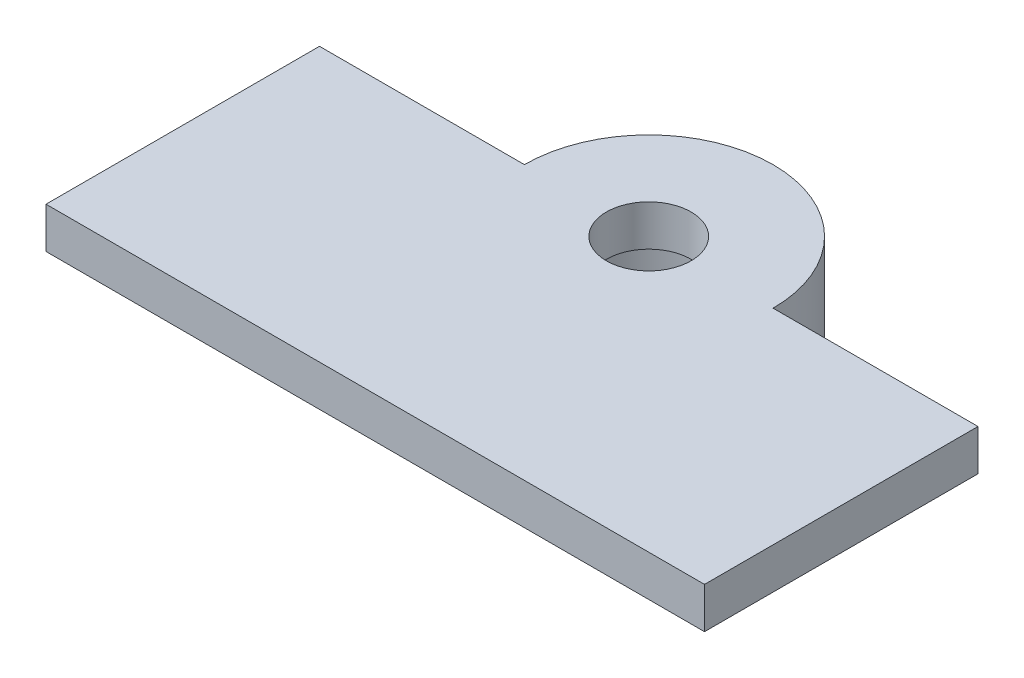
ISO-10303-21;
HEADER;
FILE_DESCRIPTION(('STEP AP214'),'2;1');
FILE_NAME('part.step','',(''),(''),'','','');
FILE_SCHEMA(('AUTOMOTIVE_DESIGN { 1 0 10303 214 1 1 1 1 }'));
ENDSEC;
DATA;
#1=APPLICATION_CONTEXT('core data for automotive mechanical design processes');
#2=APPLICATION_PROTOCOL_DEFINITION('international standard','automotive_design',2000,#1);
#3=PRODUCT_CONTEXT('',#1,'mechanical');
#4=PRODUCT('Part','Part','',(#3));
#5=PRODUCT_RELATED_PRODUCT_CATEGORY('part','',(#4));
#6=PRODUCT_DEFINITION_FORMATION('','',#4);
#7=PRODUCT_DEFINITION_CONTEXT('part definition',#1,'design');
#8=PRODUCT_DEFINITION('design','',#6,#7);
#9=PRODUCT_DEFINITION_SHAPE('','',#8);
#10=(LENGTH_UNIT() NAMED_UNIT(*) SI_UNIT(.MILLI.,.METRE.));
#11=(NAMED_UNIT(*) PLANE_ANGLE_UNIT() SI_UNIT($,.RADIAN.));
#12=(NAMED_UNIT(*) SI_UNIT($,.STERADIAN.) SOLID_ANGLE_UNIT());
#13=UNCERTAINTY_MEASURE_WITH_UNIT(LENGTH_MEASURE(1.E-05),#10,'distance_accuracy_value','');
#14=(GEOMETRIC_REPRESENTATION_CONTEXT(3) GLOBAL_UNCERTAINTY_ASSIGNED_CONTEXT((#13)) GLOBAL_UNIT_ASSIGNED_CONTEXT((#10,
#11,#12)) REPRESENTATION_CONTEXT('',''));
#15=CARTESIAN_POINT('',(0.,0.,0.));
#16=DIRECTION('',(0.,0.,1.));
#17=DIRECTION('',(1.,0.,0.));
#18=AXIS2_PLACEMENT_3D('',#15,#16,#17);
#19=CARTESIAN_POINT('',(0.,0.,0.));
#20=DIRECTION('',(0.,1.,0.));
#21=DIRECTION('',(0.,0.,1.));
#22=AXIS2_PLACEMENT_3D('',#19,#20,#21);
#23=PLANE('',#22);
#24=CARTESIAN_POINT('',(0.,0.,0.));
#25=DIRECTION('',(0.,1.,0.));
#26=DIRECTION('',(0.,0.,1.));
#27=AXIS2_PLACEMENT_3D('',#24,#25,#26);
#28=CIRCLE('',#27,9.1);
#29=CARTESIAN_POINT('',(0.,0.,9.1));
#30=VERTEX_POINT('',#29);
#31=EDGE_CURVE('E11',#30,#30,#28,.T.);
#32=ORIENTED_EDGE('',*,*,#31,.F.);
#33=EDGE_LOOP('',(#32));
#34=FACE_BOUND('',#33,.T.);
#35=CARTESIAN_POINT('',(0.,0.,0.));
#36=DIRECTION('',(0.,1.,0.));
#37=DIRECTION('',(0.,0.,1.));
#38=AXIS2_PLACEMENT_3D('',#35,#36,#37);
#39=CIRCLE('',#38,6.1);
#40=CARTESIAN_POINT('',(0.,0.,6.1));
#41=VERTEX_POINT('',#40);
#42=EDGE_CURVE('E54',#41,#41,#39,.T.);
#43=ORIENTED_EDGE('',*,*,#42,.T.);
#44=EDGE_LOOP('',(#43));
#45=FACE_BOUND('',#44,.T.);
#46=ADVANCED_FACE('F45',(#34,#45),#23,.F.);
#47=CARTESIAN_POINT('',(0.,10.,0.));
#48=DIRECTION('',(0.,-1.,0.));
#49=DIRECTION('',(0.,0.,-1.));
#50=AXIS2_PLACEMENT_3D('',#47,#48,#49);
#51=CYLINDRICAL_SURFACE('',#50,9.1);
#52=CARTESIAN_POINT('',(0.,13.,0.));
#53=DIRECTION('',(0.,1.,0.));
#54=DIRECTION('',(0.,0.,1.));
#55=AXIS2_PLACEMENT_3D('',#52,#53,#54);
#56=CIRCLE('',#55,9.1);
#57=CARTESIAN_POINT('',(9.1,13.,0.));
#58=VERTEX_POINT('',#57);
#59=CARTESIAN_POINT('',(-9.1,13.,0.));
#60=VERTEX_POINT('',#59);
#61=EDGE_CURVE('E173',#58,#60,#56,.T.);
#62=ORIENTED_EDGE('',*,*,#61,.F.);
#63=DIRECTION('',(0.,1.,0.));
#64=VECTOR('',#63,1.);
#65=CARTESIAN_POINT('',(9.1,10.,0.));
#66=LINE('',#65,#64);
#67=CARTESIAN_POINT('',(9.1,10.,0.));
#68=VERTEX_POINT('',#67);
#69=EDGE_CURVE('E154',#68,#58,#66,.T.);
#70=ORIENTED_EDGE('',*,*,#69,.F.);
#71=CARTESIAN_POINT('',(0.,10.,0.));
#72=DIRECTION('',(0.,1.,0.));
#73=DIRECTION('',(0.,0.,1.));
#74=AXIS2_PLACEMENT_3D('',#71,#72,#73);
#75=CIRCLE('',#74,9.1);
#76=CARTESIAN_POINT('',(-9.1,10.,0.));
#77=VERTEX_POINT('',#76);
#78=EDGE_CURVE('E70',#77,#68,#75,.T.);
#79=ORIENTED_EDGE('',*,*,#78,.F.);
#80=DIRECTION('',(0.,1.,0.));
#81=VECTOR('',#80,1.);
#82=CARTESIAN_POINT('',(-9.1,10.,0.));
#83=LINE('',#82,#81);
#84=EDGE_CURVE('E101',#77,#60,#83,.T.);
#85=ORIENTED_EDGE('',*,*,#84,.T.);
#86=EDGE_LOOP('',(#62,#70,#79,#85));
#87=FACE_BOUND('',#86,.T.);
#88=ORIENTED_EDGE('',*,*,#31,.T.);
#89=EDGE_LOOP('',(#88));
#90=FACE_BOUND('',#89,.T.);
#91=ADVANCED_FACE('F47',(#87,#90),#51,.T.);
#92=CARTESIAN_POINT('',(0.,10.,0.));
#93=DIRECTION('',(0.,-1.,0.));
#94=DIRECTION('',(0.,0.,-1.));
#95=AXIS2_PLACEMENT_3D('',#92,#93,#94);
#96=CYLINDRICAL_SURFACE('',#95,6.1);
#97=CARTESIAN_POINT('',(0.,10.,0.));
#98=DIRECTION('',(0.,1.,0.));
#99=DIRECTION('',(0.,0.,1.));
#100=AXIS2_PLACEMENT_3D('',#97,#98,#99);
#101=CIRCLE('',#100,6.1);
#102=CARTESIAN_POINT('',(0.,10.,6.1));
#103=VERTEX_POINT('',#102);
#104=EDGE_CURVE('E179',#103,#103,#101,.T.);
#105=ORIENTED_EDGE('',*,*,#104,.T.);
#106=EDGE_LOOP('',(#105));
#107=FACE_BOUND('',#106,.T.);
#108=ORIENTED_EDGE('',*,*,#42,.F.);
#109=EDGE_LOOP('',(#108));
#110=FACE_BOUND('',#109,.T.);
#111=ADVANCED_FACE('F187',(#107,#110),#96,.F.);
#112=CARTESIAN_POINT('',(0.,10.,0.));
#113=DIRECTION('',(0.,1.,0.));
#114=DIRECTION('',(0.,0.,1.));
#115=AXIS2_PLACEMENT_3D('',#112,#113,#114);
#116=PLANE('',#115);
#117=ORIENTED_EDGE('',*,*,#104,.F.);
#118=EDGE_LOOP('',(#117));
#119=FACE_BOUND('',#118,.T.);
#120=CARTESIAN_POINT('',(0.,10.,0.));
#121=DIRECTION('',(0.,1.,0.));
#122=DIRECTION('',(0.,0.,1.));
#123=AXIS2_PLACEMENT_3D('',#120,#121,#122);
#124=CIRCLE('',#123,3.1);
#125=CARTESIAN_POINT('',(0.,10.,3.1));
#126=VERTEX_POINT('',#125);
#127=EDGE_CURVE('E168',#126,#126,#124,.T.);
#128=ORIENTED_EDGE('',*,*,#127,.T.);
#129=EDGE_LOOP('',(#128));
#130=FACE_BOUND('',#129,.T.);
#131=ADVANCED_FACE('F189',(#119,#130),#116,.F.);
#132=CARTESIAN_POINT('',(0.,13.,0.));
#133=DIRECTION('',(0.,1.,0.));
#134=DIRECTION('',(0.,0.,1.));
#135=AXIS2_PLACEMENT_3D('',#132,#133,#134);
#136=PLANE('',#135);
#137=ORIENTED_EDGE('',*,*,#61,.T.);
#138=DIRECTION('',(-1.,0.,0.));
#139=VECTOR('',#138,1.);
#140=CARTESIAN_POINT('',(-9.1,13.,0.));
#141=LINE('',#140,#139);
#142=CARTESIAN_POINT('',(-24.1,13.,0.));
#143=VERTEX_POINT('',#142);
#144=EDGE_CURVE('E139',#60,#143,#141,.T.);
#145=ORIENTED_EDGE('',*,*,#144,.T.);
#146=DIRECTION('',(0.,0.,1.));
#147=VECTOR('',#146,1.);
#148=CARTESIAN_POINT('',(-24.1,13.,0.));
#149=LINE('',#148,#147);
#150=CARTESIAN_POINT('',(-24.1,13.,20.0184921887861));
#151=VERTEX_POINT('',#150);
#152=EDGE_CURVE('E143',#143,#151,#149,.T.);
#153=ORIENTED_EDGE('',*,*,#152,.T.);
#154=DIRECTION('',(1.,0.,0.));
#155=VECTOR('',#154,1.);
#156=CARTESIAN_POINT('',(-24.1,13.,20.0184921887861));
#157=LINE('',#156,#155);
#158=CARTESIAN_POINT('',(24.1,13.,20.0184921887861));
#159=VERTEX_POINT('',#158);
#160=EDGE_CURVE('E147',#151,#159,#157,.T.);
#161=ORIENTED_EDGE('',*,*,#160,.T.);
#162=DIRECTION('',(0.,0.,-1.));
#163=VECTOR('',#162,1.);
#164=CARTESIAN_POINT('',(24.1,13.,20.0184921887861));
#165=LINE('',#164,#163);
#166=CARTESIAN_POINT('',(24.1,13.,0.));
#167=VERTEX_POINT('',#166);
#168=EDGE_CURVE('E112',#159,#167,#165,.T.);
#169=ORIENTED_EDGE('',*,*,#168,.T.);
#170=DIRECTION('',(-1.,0.,0.));
#171=VECTOR('',#170,1.);
#172=CARTESIAN_POINT('',(24.1,13.,0.));
#173=LINE('',#172,#171);
#174=EDGE_CURVE('E61',#167,#58,#173,.T.);
#175=ORIENTED_EDGE('',*,*,#174,.T.);
#176=EDGE_LOOP('',(#137,#145,#153,#161,#169,#175));
#177=FACE_BOUND('',#176,.T.);
#178=CARTESIAN_POINT('',(0.,13.,0.));
#179=DIRECTION('',(0.,1.,0.));
#180=DIRECTION('',(0.,0.,1.));
#181=AXIS2_PLACEMENT_3D('',#178,#179,#180);
#182=CIRCLE('',#181,3.1);
#183=CARTESIAN_POINT('',(0.,13.,3.1));
#184=VERTEX_POINT('',#183);
#185=EDGE_CURVE('E169',#184,#184,#182,.T.);
#186=ORIENTED_EDGE('',*,*,#185,.F.);
#187=EDGE_LOOP('',(#186));
#188=FACE_BOUND('',#187,.T.);
#189=ADVANCED_FACE('F196',(#177,#188),#136,.T.);
#190=CARTESIAN_POINT('',(0.,13.,0.));
#191=DIRECTION('',(0.,-1.,0.));
#192=DIRECTION('',(0.,0.,-1.));
#193=AXIS2_PLACEMENT_3D('',#190,#191,#192);
#194=CYLINDRICAL_SURFACE('',#193,3.1);
#195=ORIENTED_EDGE('',*,*,#185,.T.);
#196=EDGE_LOOP('',(#195));
#197=FACE_BOUND('',#196,.T.);
#198=ORIENTED_EDGE('',*,*,#127,.F.);
#199=EDGE_LOOP('',(#198));
#200=FACE_BOUND('',#199,.T.);
#201=ADVANCED_FACE('F211',(#197,#200),#194,.F.);
#202=CARTESIAN_POINT('',(24.1,10.,0.));
#203=DIRECTION('',(0.,0.,-1.));
#204=DIRECTION('',(-1.,0.,0.));
#205=AXIS2_PLACEMENT_3D('',#202,#203,#204);
#206=PLANE('',#205);
#207=ORIENTED_EDGE('',*,*,#174,.F.);
#208=DIRECTION('',(0.,1.,0.));
#209=VECTOR('',#208,1.);
#210=CARTESIAN_POINT('',(24.1,10.,0.));
#211=LINE('',#210,#209);
#212=CARTESIAN_POINT('',(24.1,10.,0.));
#213=VERTEX_POINT('',#212);
#214=EDGE_CURVE('E94',#213,#167,#211,.T.);
#215=ORIENTED_EDGE('',*,*,#214,.F.);
#216=DIRECTION('',(-1.,0.,0.));
#217=VECTOR('',#216,1.);
#218=CARTESIAN_POINT('',(24.1,10.,0.));
#219=LINE('',#218,#217);
#220=EDGE_CURVE('E125',#213,#68,#219,.T.);
#221=ORIENTED_EDGE('',*,*,#220,.T.);
#222=ORIENTED_EDGE('',*,*,#69,.T.);
#223=EDGE_LOOP('',(#207,#215,#221,#222));
#224=FACE_BOUND('',#223,.T.);
#225=ADVANCED_FACE('F214',(#224),#206,.T.);
#226=CARTESIAN_POINT('',(24.1,10.,20.0184921887861));
#227=DIRECTION('',(1.,0.,0.));
#228=DIRECTION('',(0.,0.,-1.));
#229=AXIS2_PLACEMENT_3D('',#226,#227,#228);
#230=PLANE('',#229);
#231=ORIENTED_EDGE('',*,*,#168,.F.);
#232=DIRECTION('',(0.,1.,0.));
#233=VECTOR('',#232,1.);
#234=CARTESIAN_POINT('',(24.1,10.,20.0184921887861));
#235=LINE('',#234,#233);
#236=CARTESIAN_POINT('',(24.1,10.,20.0184921887861));
#237=VERTEX_POINT('',#236);
#238=EDGE_CURVE('E108',#237,#159,#235,.T.);
#239=ORIENTED_EDGE('',*,*,#238,.F.);
#240=DIRECTION('',(0.,0.,-1.));
#241=VECTOR('',#240,1.);
#242=CARTESIAN_POINT('',(24.1,10.,20.0184921887861));
#243=LINE('',#242,#241);
#244=EDGE_CURVE('E111',#237,#213,#243,.T.);
#245=ORIENTED_EDGE('',*,*,#244,.T.);
#246=ORIENTED_EDGE('',*,*,#214,.T.);
#247=EDGE_LOOP('',(#231,#239,#245,#246));
#248=FACE_BOUND('',#247,.T.);
#249=ADVANCED_FACE('F110',(#248),#230,.T.);
#250=CARTESIAN_POINT('',(-24.1,10.,20.0184921887861));
#251=DIRECTION('',(0.,0.,1.));
#252=DIRECTION('',(1.,0.,0.));
#253=AXIS2_PLACEMENT_3D('',#250,#251,#252);
#254=PLANE('',#253);
#255=ORIENTED_EDGE('',*,*,#160,.F.);
#256=DIRECTION('',(0.,1.,0.));
#257=VECTOR('',#256,1.);
#258=CARTESIAN_POINT('',(-24.1,10.,20.0184921887861));
#259=LINE('',#258,#257);
#260=CARTESIAN_POINT('',(-24.1,10.,20.0184921887861));
#261=VERTEX_POINT('',#260);
#262=EDGE_CURVE('E118',#261,#151,#259,.T.);
#263=ORIENTED_EDGE('',*,*,#262,.F.);
#264=DIRECTION('',(1.,0.,0.));
#265=VECTOR('',#264,1.);
#266=CARTESIAN_POINT('',(-24.1,10.,20.0184921887861));
#267=LINE('',#266,#265);
#268=EDGE_CURVE('E123',#261,#237,#267,.T.);
#269=ORIENTED_EDGE('',*,*,#268,.T.);
#270=ORIENTED_EDGE('',*,*,#238,.T.);
#271=EDGE_LOOP('',(#255,#263,#269,#270));
#272=FACE_BOUND('',#271,.T.);
#273=ADVANCED_FACE('F128',(#272),#254,.T.);
#274=CARTESIAN_POINT('',(-24.1,10.,0.));
#275=DIRECTION('',(-1.,0.,0.));
#276=DIRECTION('',(0.,0.,1.));
#277=AXIS2_PLACEMENT_3D('',#274,#275,#276);
#278=PLANE('',#277);
#279=ORIENTED_EDGE('',*,*,#152,.F.);
#280=DIRECTION('',(0.,1.,0.));
#281=VECTOR('',#280,1.);
#282=CARTESIAN_POINT('',(-24.1,10.,0.));
#283=LINE('',#282,#281);
#284=CARTESIAN_POINT('',(-24.1,10.,0.));
#285=VERTEX_POINT('',#284);
#286=EDGE_CURVE('E161',#285,#143,#283,.T.);
#287=ORIENTED_EDGE('',*,*,#286,.F.);
#288=DIRECTION('',(0.,0.,1.));
#289=VECTOR('',#288,1.);
#290=CARTESIAN_POINT('',(-24.1,10.,0.));
#291=LINE('',#290,#289);
#292=EDGE_CURVE('E130',#285,#261,#291,.T.);
#293=ORIENTED_EDGE('',*,*,#292,.T.);
#294=ORIENTED_EDGE('',*,*,#262,.T.);
#295=EDGE_LOOP('',(#279,#287,#293,#294));
#296=FACE_BOUND('',#295,.T.);
#297=ADVANCED_FACE('F270',(#296),#278,.T.);
#298=CARTESIAN_POINT('',(-9.1,10.,0.));
#299=DIRECTION('',(0.,0.,-1.));
#300=DIRECTION('',(-1.,0.,0.));
#301=AXIS2_PLACEMENT_3D('',#298,#299,#300);
#302=PLANE('',#301);
#303=ORIENTED_EDGE('',*,*,#144,.F.);
#304=ORIENTED_EDGE('',*,*,#84,.F.);
#305=DIRECTION('',(-1.,0.,0.));
#306=VECTOR('',#305,1.);
#307=CARTESIAN_POINT('',(-9.1,10.,0.));
#308=LINE('',#307,#306);
#309=EDGE_CURVE('E133',#77,#285,#308,.T.);
#310=ORIENTED_EDGE('',*,*,#309,.T.);
#311=ORIENTED_EDGE('',*,*,#286,.T.);
#312=EDGE_LOOP('',(#303,#304,#310,#311));
#313=FACE_BOUND('',#312,.T.);
#314=ADVANCED_FACE('F279',(#313),#302,.T.);
#315=CARTESIAN_POINT('',(0.,10.,0.));
#316=DIRECTION('',(0.,1.,0.));
#317=DIRECTION('',(0.,0.,1.));
#318=AXIS2_PLACEMENT_3D('',#315,#316,#317);
#319=PLANE('',#318);
#320=ORIENTED_EDGE('',*,*,#309,.F.);
#321=ORIENTED_EDGE('',*,*,#78,.T.);
#322=ORIENTED_EDGE('',*,*,#220,.F.);
#323=ORIENTED_EDGE('',*,*,#244,.F.);
#324=ORIENTED_EDGE('',*,*,#268,.F.);
#325=ORIENTED_EDGE('',*,*,#292,.F.);
#326=EDGE_LOOP('',(#320,#321,#322,#323,#324,#325));
#327=FACE_BOUND('',#326,.T.);
#328=ADVANCED_FACE('F121',(#327),#319,.F.);
#329=CLOSED_SHELL('',(#46,#91,#111,#131,#189,#201,#225,#249,#273,#297,#314,#328));
#330=MANIFOLD_SOLID_BREP('B2',#329);
#331=ADVANCED_BREP_SHAPE_REPRESENTATION('',(#18,#330),#14);
#332=SHAPE_DEFINITION_REPRESENTATION(#9,#331);
ENDSEC;
END-ISO-10303-21;
